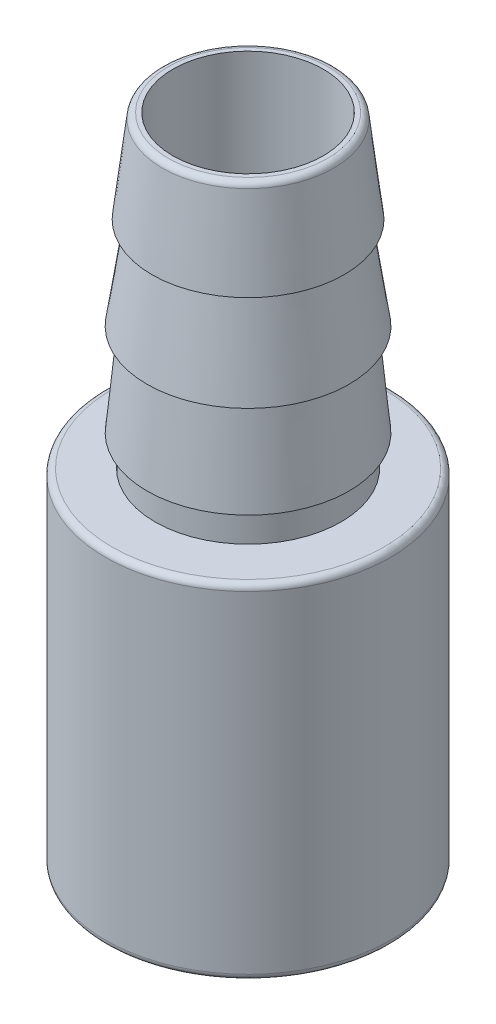
ISO-10303-21;
HEADER;
FILE_DESCRIPTION(('STEP AP214'),'2;1');
FILE_NAME('part.step','',(''),(''),'','','');
FILE_SCHEMA(('AUTOMOTIVE_DESIGN { 1 0 10303 214 1 1 1 1 }'));
ENDSEC;
DATA;
#1=APPLICATION_CONTEXT('core data for automotive mechanical design processes');
#2=APPLICATION_PROTOCOL_DEFINITION('international standard','automotive_design',2000,#1);
#3=PRODUCT_CONTEXT('',#1,'mechanical');
#4=PRODUCT('Part','Part','',(#3));
#5=PRODUCT_RELATED_PRODUCT_CATEGORY('part','',(#4));
#6=PRODUCT_DEFINITION_FORMATION('','',#4);
#7=PRODUCT_DEFINITION_CONTEXT('part definition',#1,'design');
#8=PRODUCT_DEFINITION('design','',#6,#7);
#9=PRODUCT_DEFINITION_SHAPE('','',#8);
#10=(LENGTH_UNIT() NAMED_UNIT(*) SI_UNIT(.MILLI.,.METRE.));
#11=(NAMED_UNIT(*) PLANE_ANGLE_UNIT() SI_UNIT($,.RADIAN.));
#12=(NAMED_UNIT(*) SI_UNIT($,.STERADIAN.) SOLID_ANGLE_UNIT());
#13=UNCERTAINTY_MEASURE_WITH_UNIT(LENGTH_MEASURE(1.E-05),#10,'distance_accuracy_value','');
#14=(GEOMETRIC_REPRESENTATION_CONTEXT(3) GLOBAL_UNCERTAINTY_ASSIGNED_CONTEXT((#13)) GLOBAL_UNIT_ASSIGNED_CONTEXT((#10,
#11,#12)) REPRESENTATION_CONTEXT('',''));
#15=CARTESIAN_POINT('',(0.,0.,0.));
#16=DIRECTION('',(0.,0.,1.));
#17=DIRECTION('',(1.,0.,0.));
#18=AXIS2_PLACEMENT_3D('',#15,#16,#17);
#19=CARTESIAN_POINT('',(0.,25.8957166504671,0.));
#20=DIRECTION('',(0.,-1.,0.));
#21=DIRECTION('',(0.,0.,-1.));
#22=AXIS2_PLACEMENT_3D('',#19,#20,#21);
#23=PLANE('',#22);
#24=CARTESIAN_POINT('',(0.,25.8957166504671,0.));
#25=DIRECTION('',(0.,1.,0.));
#26=DIRECTION('',(0.,0.,1.));
#27=AXIS2_PLACEMENT_3D('',#24,#25,#26);
#28=CIRCLE('',#27,6.10000000000001);
#29=CARTESIAN_POINT('',(0.,25.8957166504671,6.10000000000001));
#30=VERTEX_POINT('',#29);
#31=EDGE_CURVE('E77',#30,#30,#28,.T.);
#32=ORIENTED_EDGE('',*,*,#31,.T.);
#33=EDGE_LOOP('',(#32));
#34=FACE_BOUND('',#33,.T.);
#35=CARTESIAN_POINT('',(0.,25.8957166504671,0.));
#36=DIRECTION('',(0.,1.,0.));
#37=DIRECTION('',(0.,0.,1.));
#38=AXIS2_PLACEMENT_3D('',#35,#36,#37);
#39=CIRCLE('',#38,7.55000000000001);
#40=CARTESIAN_POINT('',(0.,25.8957166504671,7.55000000000001));
#41=VERTEX_POINT('',#40);
#42=EDGE_CURVE('E121',#41,#41,#39,.T.);
#43=ORIENTED_EDGE('',*,*,#42,.F.);
#44=EDGE_LOOP('',(#43));
#45=FACE_BOUND('',#44,.T.);
#46=ADVANCED_FACE('F32',(#34,#45),#23,.T.);
#47=CARTESIAN_POINT('',(0.,70.3957166504671,0.));
#48=DIRECTION('',(0.,1.,0.));
#49=DIRECTION('',(0.,0.,1.));
#50=AXIS2_PLACEMENT_3D('',#47,#48,#49);
#51=CYLINDRICAL_SURFACE('',#50,7.55000000000001);
#52=CARTESIAN_POINT('',(1.,13.674991934975,-7.48348180995986));
#53=CARTESIAN_POINT('',(0.999997640613019,13.6190864539056,-7.48348265423926));
#54=CARTESIAN_POINT('',(0.995296036754025,13.5631467247339,-7.4841150428414));
#55=CARTESIAN_POINT('',(0.976615883573541,13.4528260852176,-7.48657510165519));
#56=CARTESIAN_POINT('',(0.962627820510983,13.3984468332058,-7.4884039976302));
#57=CARTESIAN_POINT('',(0.925796103794292,13.2928602684275,-7.49304636890852));
#58=CARTESIAN_POINT('',(0.902958679565293,13.2416507536976,-7.49585915147884));
#59=CARTESIAN_POINT('',(0.84909024391177,13.143799773336,-7.50215153565137));
#60=CARTESIAN_POINT('',(0.818060556641651,13.0971575711365,-7.50563102946498));
#61=CARTESIAN_POINT('',(0.748480281164118,13.0094639626732,-7.51288919731403));
#62=CARTESIAN_POINT('',(0.709888543770355,12.9684453320248,-7.51666943783157));
#63=CARTESIAN_POINT('',(0.626368327509635,12.8934466140255,-7.52408910606824));
#64=CARTESIAN_POINT('',(0.581439524576133,12.8594668868515,-7.52772852657394));
#65=CARTESIAN_POINT('',(0.486313307119333,12.7993919338889,-7.53447263712252));
#66=CARTESIAN_POINT('',(0.436096901852783,12.7733265305236,-7.53757528609556));
#67=CARTESIAN_POINT('',(0.331951392465927,12.7300112397034,-7.54287901138871));
#68=CARTESIAN_POINT('',(0.27802244247006,12.7127609865419,-7.54508012510927));
#69=CARTESIAN_POINT('',(0.168318686206344,12.6876640341342,-7.5483217352535));
#70=CARTESIAN_POINT('',(0.112556578728956,12.6797627104133,-7.54936897112421));
#71=CARTESIAN_POINT('',(0.000488745168111114,12.6734185266338,-7.55020786913315));
#72=CARTESIAN_POINT('',(-0.0558169569485143,12.6749752514588,-7.54999958637649));
#73=CARTESIAN_POINT('',(-0.167001732315232,12.6874593859268,-7.54835634851858));
#74=CARTESIAN_POINT('',(-0.221887532155587,12.6983280431177,-7.54692908460145));
#75=CARTESIAN_POINT('',(-0.329049268191321,12.7290355725875,-7.54301686104313));
#76=CARTESIAN_POINT('',(-0.381325149669249,12.748874632845,-7.54053187923707));
#77=CARTESIAN_POINT('',(-0.481963880824524,12.7970216343162,-7.53477017709603));
#78=CARTESIAN_POINT('',(-0.530314519173603,12.8253548070782,-7.53149110358868));
#79=CARTESIAN_POINT('',(-0.621597073702879,12.8896673867975,-7.52450769037079));
#80=CARTESIAN_POINT('',(-0.664528710848169,12.9256471872387,-7.52080332878008));
#81=CARTESIAN_POINT('',(-0.744100092821038,13.0045602658171,-7.51334995766458));
#82=CARTESIAN_POINT('',(-0.780689037497986,13.0475447749502,-7.5096008236412));
#83=CARTESIAN_POINT('',(-0.846141068694628,13.1390716527936,-7.5025084155099));
#84=CARTESIAN_POINT('',(-0.875004125317424,13.1876140430104,-7.49916514297256));
#85=CARTESIAN_POINT('',(-0.924189065956958,13.2889261475474,-7.49326307475917));
#86=CARTESIAN_POINT('',(-0.944506559853983,13.3416980181499,-7.49070468248253));
#87=CARTESIAN_POINT('',(-0.975976904681863,13.4499461142858,-7.48666969582466));
#88=CARTESIAN_POINT('',(-0.987130253631255,13.5054221926875,-7.48519304265759));
#89=CARTESIAN_POINT('',(-0.999887763056672,13.6170543546708,-7.48349959875886));
#90=CARTESIAN_POINT('',(-1.00156356013777,13.6732021134431,-7.4832733570197));
#91=CARTESIAN_POINT('',(-0.995507710475869,13.784977597904,-7.48408133066248));
#92=CARTESIAN_POINT('',(-0.987776289556676,13.8406053360435,-7.48511551578741));
#93=CARTESIAN_POINT('',(-0.963185912333842,13.9495450141197,-7.48831917716092));
#94=CARTESIAN_POINT('',(-0.946361923098478,14.0028649860005,-7.49048430311605));
#95=CARTESIAN_POINT('',(-0.904100080061533,14.1059274071525,-7.49570234921866));
#96=CARTESIAN_POINT('',(-0.878661888714919,14.1556697161414,-7.49875530415481));
#97=CARTESIAN_POINT('',(-0.819718732023109,14.2504880862665,-7.50542755458955));
#98=CARTESIAN_POINT('',(-0.786166957817709,14.2955348170926,-7.50905009207914));
#99=CARTESIAN_POINT('',(-0.712014907974461,14.3793834274715,-7.5164432808062));
#100=CARTESIAN_POINT('',(-0.671414323737639,14.4181850334675,-7.52021393852282));
#101=CARTESIAN_POINT('',(-0.584003499352055,14.4886951771338,-7.52750768704761));
#102=CARTESIAN_POINT('',(-0.537155029687152,14.5203565287481,-7.5310290311412));
#103=CARTESIAN_POINT('',(-0.438763239146897,14.5753602911591,-7.53740099768828));
#104=CARTESIAN_POINT('',(-0.38722002273137,14.5987028869945,-7.54025163506019));
#105=CARTESIAN_POINT('',(-0.28105599632715,14.6363293090077,-7.54495327577493));
#106=CARTESIAN_POINT('',(-0.226444841506163,14.6506399920988,-7.54680724032166));
#107=CARTESIAN_POINT('',(-0.115568535814665,14.6698836134998,-7.54931897967579));
#108=CARTESIAN_POINT('',(-0.0593034693102814,14.6748170293045,-7.54997681539056));
#109=CARTESIAN_POINT('',(0.0528236449198729,14.6751563891076,-7.55002180016256));
#110=CARTESIAN_POINT('',(0.108685482852354,14.670634931915,-7.54941863179005));
#111=CARTESIAN_POINT('',(0.218847676466017,14.6523471715739,-7.54702869960805));
#112=CARTESIAN_POINT('',(0.273148034208349,14.6385808806291,-7.54524193736098));
#113=CARTESIAN_POINT('',(0.378633419365933,14.6022178763951,-7.54068464787495));
#114=CARTESIAN_POINT('',(0.429819817243945,14.5796250806478,-7.53791455712472));
#115=CARTESIAN_POINT('',(0.527686400251396,14.5262579445694,-7.53169664704556));
#116=CARTESIAN_POINT('',(0.574366505358342,14.4954834589847,-7.52824881568465));
#117=CARTESIAN_POINT('',(0.662265660663392,14.4263595184914,-7.52102827785906));
#118=CARTESIAN_POINT('',(0.703442125090811,14.3879561367056,-7.5172533731582));
#119=CARTESIAN_POINT('',(0.778793927128469,14.3047772577294,-7.50982140164662));
#120=CARTESIAN_POINT('',(0.812967609534731,14.2600002582752,-7.50616436286687));
#121=CARTESIAN_POINT('',(0.87347263568008,14.1651205179634,-7.49936526266101));
#122=CARTESIAN_POINT('',(0.899769331784437,14.1149955260788,-7.49622550298327));
#123=CARTESIAN_POINT('',(0.943533587720554,14.0110259446555,-7.49084340201406));
#124=CARTESIAN_POINT('',(0.961010628019889,13.9571854201333,-7.48860009764286));
#125=CARTESIAN_POINT('',(0.982515613613414,13.8650620170025,-7.48580228841438));
#126=CARTESIAN_POINT('',(0.98906266437653,13.8273571008755,-7.48493651966568));
#127=CARTESIAN_POINT('',(0.997805644846225,13.7514374371102,-7.48377599431257));
#128=CARTESIAN_POINT('',(1.00000161345817,13.7132226940337,-7.48348123260248));
#129=CARTESIAN_POINT('',(1.,13.674991934975,-7.48348180995986));
#130=B_SPLINE_CURVE_WITH_KNOTS('',3,(#52,#53,#54,#55,#56,#57,#58,#59,#60,#61,#62,#63,#64,#65,
#66,#67,#68,#69,#70,#71,#72,#73,#74,#75,#76,#77,#78,#79,#80,#81,#82,#83,#84,#85,#86,#87,#88,#89,
#90,#91,#92,#93,#94,#95,#96,#97,#98,#99,#100,#101,#102,#103,#104,#105,#106,#107,#108,#109,#110,
#111,#112,#113,#114,#115,#116,#117,#118,#119,#120,#121,#122,#123,#124,#125,#126,#127,#128,#129),
.UNSPECIFIED.,.T.,.F.,(4,2,2,2,2,2,2,2,2,2,2,2,2,2,2,2,2,2,2,2,2,2,2,2,2,2,2,2,2,2,2,2,2,2,2,2,
2,2,4),(0.,0.167576760071937,0.335325463741895,0.502956296172008,0.67056005020457,
0.839102507506484,1.00765358690444,1.17683212896286,1.34600365188916,1.51418177018709,
1.682352507149,1.84946994081086,2.01659087665251,2.18421324449273,2.35184424001652,
2.52076134429805,2.68967910222928,2.85868353275346,3.0276787782519,3.19539493890875,
3.36310707355562,3.5301787840262,3.6972570419114,3.8653232213909,4.03339676071346,
4.20255042353081,4.37170032353661,4.54034484696533,4.70898078270494,4.87632661132946,
5.04367221904775,5.21094363658444,5.37821802397133,5.54671984363562,5.71526144520251,
5.88453385885968,6.05362392772651,6.16822170778501,6.28281846315849),.UNSPECIFIED.);
#131=CARTESIAN_POINT('',(1.,13.674991934975,-7.48348180995986));
#132=VERTEX_POINT('',#131);
#133=EDGE_CURVE('E70',#132,#132,#130,.T.);
#134=ORIENTED_EDGE('',*,*,#133,.T.);
#135=EDGE_LOOP('',(#134));
#136=FACE_BOUND('',#135,.T.);
#137=CARTESIAN_POINT('',(0.,0.5,0.));
#138=DIRECTION('',(0.,-1.,0.));
#139=DIRECTION('',(0.,0.,-1.));
#140=AXIS2_PLACEMENT_3D('',#137,#138,#139);
#141=CIRCLE('',#140,7.55000000000001);
#142=CARTESIAN_POINT('',(0.,0.5,-7.55000000000001));
#143=VERTEX_POINT('',#142);
#144=EDGE_CURVE('E110',#143,#143,#141,.T.);
#145=ORIENTED_EDGE('',*,*,#144,.T.);
#146=EDGE_LOOP('',(#145));
#147=FACE_BOUND('',#146,.T.);
#148=ORIENTED_EDGE('',*,*,#42,.T.);
#149=EDGE_LOOP('',(#148));
#150=FACE_BOUND('',#149,.T.);
#151=ADVANCED_FACE('F79',(#136,#147,#150),#51,.F.);
#152=CARTESIAN_POINT('',(0.,0.,0.));
#153=DIRECTION('',(0.,-1.,0.));
#154=DIRECTION('',(0.,0.,-1.));
#155=AXIS2_PLACEMENT_3D('',#152,#153,#154);
#156=PLANE('',#155);
#157=CARTESIAN_POINT('',(0.,0.,0.));
#158=DIRECTION('',(0.,-1.,0.));
#159=DIRECTION('',(0.,0.,-1.));
#160=AXIS2_PLACEMENT_3D('',#157,#158,#159);
#161=CIRCLE('',#160,8.05000000000001);
#162=CARTESIAN_POINT('',(0.,0.,-8.05000000000001));
#163=VERTEX_POINT('',#162);
#164=EDGE_CURVE('E115',#163,#163,#161,.F.);
#165=ORIENTED_EDGE('',*,*,#164,.T.);
#166=EDGE_LOOP('',(#165));
#167=FACE_BOUND('',#166,.T.);
#168=CARTESIAN_POINT('',(0.,0.,0.));
#169=DIRECTION('',(0.,-1.,0.));
#170=DIRECTION('',(0.,0.,-1.));
#171=AXIS2_PLACEMENT_3D('',#168,#169,#170);
#172=CIRCLE('',#171,11.05);
#173=CARTESIAN_POINT('',(0.,0.,-11.05));
#174=VERTEX_POINT('',#173);
#175=EDGE_CURVE('E118',#174,#174,#172,.T.);
#176=ORIENTED_EDGE('',*,*,#175,.T.);
#177=EDGE_LOOP('',(#176));
#178=FACE_BOUND('',#177,.T.);
#179=ADVANCED_FACE('F83',(#167,#178),#156,.T.);
#180=CARTESIAN_POINT('',(0.,70.3957166504671,0.));
#181=DIRECTION('',(0.,1.,0.));
#182=DIRECTION('',(0.,0.,1.));
#183=AXIS2_PLACEMENT_3D('',#180,#181,#182);
#184=CYLINDRICAL_SURFACE('',#183,11.55);
#185=CARTESIAN_POINT('',(0.,14.674991934975,-11.55));
#186=CARTESIAN_POINT('',(0.0560578244863341,14.6749894900842,-11.5499994344142));
#187=CARTESIAN_POINT('',(0.112153612463427,14.6702623572232,-11.5495875376148));
#188=CARTESIAN_POINT('',(0.22279256491471,14.6514748111112,-11.5479840030939));
#189=CARTESIAN_POINT('',(0.277333906755566,14.6374038764975,-11.5467914863958));
#190=CARTESIAN_POINT('',(0.383245599229549,14.6003391726797,-11.5437614458452));
#191=CARTESIAN_POINT('',(0.434617746490383,14.5773505138554,-11.5419242914654));
#192=CARTESIAN_POINT('',(0.53276210303234,14.523112212472,-11.5378108938728));
#193=CARTESIAN_POINT('',(0.579535280856685,14.4918643144437,-11.5355347434129));
#194=CARTESIAN_POINT('',(0.667294170547527,14.4219022567648,-11.5307917163195));
#195=CARTESIAN_POINT('',(0.708265544079087,14.3831701403145,-11.5283243897037));
#196=CARTESIAN_POINT('',(0.783134731316184,14.2993771309654,-11.5234808589613));
#197=CARTESIAN_POINT('',(0.817032231391381,14.2543159576068,-11.5211046588788));
#198=CARTESIAN_POINT('',(0.876840449139779,14.159056528797,-11.5167076364597));
#199=CARTESIAN_POINT('',(0.902738487976201,14.1088502846138,-11.5146873804356));
#200=CARTESIAN_POINT('',(0.945731650141792,14.0047815071507,-11.5112362308391));
#201=CARTESIAN_POINT('',(0.962826940093408,13.9509190430993,-11.5098053261113));
#202=CARTESIAN_POINT('',(0.987687551404368,13.8412110003161,-11.5076987351699));
#203=CARTESIAN_POINT('',(0.995476323109767,13.7853707726408,-11.5070211510579));
#204=CARTESIAN_POINT('',(1.00157525638104,13.6731717858507,-11.5064919443972));
#205=CARTESIAN_POINT('',(0.99988560867587,13.6168130371926,-11.5066403052285));
#206=CARTESIAN_POINT('',(0.987095037094844,13.5053377011433,-11.5077444990457));
#207=CARTESIAN_POINT('',(0.976019620402118,13.4502181623723,-11.5086981435319));
#208=CARTESIAN_POINT('',(0.944811540217406,13.3426233089083,-11.5113020227798));
#209=CARTESIAN_POINT('',(0.924678782110638,13.290148021844,-11.5129522648184));
#210=CARTESIAN_POINT('',(0.875899028289694,13.1892500944198,-11.5167659171675));
#211=CARTESIAN_POINT('',(0.847240611661792,13.1408330026169,-11.5189300150458));
#212=CARTESIAN_POINT('',(0.782231276396427,13.0494865339873,-11.5235269149064));
#213=CARTESIAN_POINT('',(0.745880189419656,13.0065572772842,-11.5259597227683));
#214=CARTESIAN_POINT('',(0.666374432830062,12.927256788038,-11.5308296650488));
#215=CARTESIAN_POINT('',(0.623197715994081,12.8909076553685,-11.5332667872675));
#216=CARTESIAN_POINT('',(0.53134317985483,12.8259701801145,-11.5378631226712));
#217=CARTESIAN_POINT('',(0.482665356480305,12.7973818432737,-11.5400223356505));
#218=CARTESIAN_POINT('',(0.381175856208747,12.7487787650232,-11.5438200299217));
#219=CARTESIAN_POINT('',(0.328363695820544,12.7287650281493,-11.5454584501956));
#220=CARTESIAN_POINT('',(0.220111371250544,12.6978948699206,-11.5480292703998));
#221=CARTESIAN_POINT('',(0.164671265975845,12.6870382434056,-11.5489616861477));
#222=CARTESIAN_POINT('',(0.0529283196158,12.6748182531018,-11.5500134092372));
#223=CARTESIAN_POINT('',(-0.00337116027521723,12.6734243690096,-11.55013533065));
#224=CARTESIAN_POINT('',(-0.115402988330331,12.680089440653,-11.5495593145534));
#225=CARTESIAN_POINT('',(-0.171135342205555,12.6881483011013,-11.5488613853083));
#226=CARTESIAN_POINT('',(-0.280363664539787,12.7134647997182,-11.5467258262852));
#227=CARTESIAN_POINT('',(-0.333862942028466,12.730708265294,-11.5452893362848));
#228=CARTESIAN_POINT('',(-0.437209028822321,12.7738900038199,-11.5418379864581));
#229=CARTESIAN_POINT('',(-0.487055775938352,12.7998284247712,-11.539823116787));
#230=CARTESIAN_POINT('',(-0.581820565559558,12.8597402929963,-11.5354342685125));
#231=CARTESIAN_POINT('',(-0.626725802041461,12.8937339293042,-11.533059393093));
#232=CARTESIAN_POINT('',(-0.710203541496391,12.9687621489677,-11.5282202750518));
#233=CARTESIAN_POINT('',(-0.748775925655149,13.0097968643954,-11.5257560307545));
#234=CARTESIAN_POINT('',(-0.818597953438829,13.097874989501,-11.5210081488787));
#235=CARTESIAN_POINT('',(-0.849827659897879,13.1449342347962,-11.518725013931));
#236=CARTESIAN_POINT('',(-0.903941069415019,13.2436468870371,-11.5146050806873));
#237=CARTESIAN_POINT('',(-0.926824861457194,13.2953002449932,-11.5127682776327));
#238=CARTESIAN_POINT('',(-0.963562999307351,13.4016646805168,-11.5097518652615));
#239=CARTESIAN_POINT('',(-0.977429487809073,13.456371537933,-11.5085713724703));
#240=CARTESIAN_POINT('',(-0.995778910376381,13.5673476889178,-11.5069983276898));
#241=CARTESIAN_POINT('',(-1.00026204059386,13.6236169498006,-11.5066057592295));
#242=CARTESIAN_POINT('',(-0.999715140480273,13.7359224928083,-11.5066532728225));
#243=CARTESIAN_POINT('',(-0.994716434214648,13.7919589312902,-11.5070906132021));
#244=CARTESIAN_POINT('',(-0.975413137997987,13.9023931553893,-11.5087428384314));
#245=CARTESIAN_POINT('',(-0.961108534450059,13.9567909386121,-11.5099577244172));
#246=CARTESIAN_POINT('',(-0.923607567206043,14.062405316279,-11.5130274255696));
#247=CARTESIAN_POINT('',(-0.900411834949563,14.1136221363321,-11.5148821952915));
#248=CARTESIAN_POINT('',(-0.845790497448002,14.2114398916793,-11.5190227584808));
#249=CARTESIAN_POINT('',(-0.814365006271921,14.2580408909389,-11.521308545974));
#250=CARTESIAN_POINT('',(-0.744058456973401,14.3454645548989,-11.5260625904387));
#251=CARTESIAN_POINT('',(-0.705154166667019,14.3862685061081,-11.5285314008737));
#252=CARTESIAN_POINT('',(-0.621037442344666,14.4607844391184,-11.5333682566656));
#253=CARTESIAN_POINT('',(-0.575823487124325,14.494494705765,-11.5357362775428));
#254=CARTESIAN_POINT('',(-0.480277128609662,14.5539153494359,-11.540109351426));
#255=CARTESIAN_POINT('',(-0.429934778869163,14.579609772344,-11.5421136772879));
#256=CARTESIAN_POINT('',(-0.325666932187058,14.6221478597633,-11.5455251383361));
#257=CARTESIAN_POINT('',(-0.271745620074903,14.6390016630384,-11.5469329572616));
#258=CARTESIAN_POINT('',(-0.181257066127906,14.6591039348296,-11.548632753835));
#259=CARTESIAN_POINT('',(-0.145271168532271,14.6650539760715,-11.5491431268318));
#260=CARTESIAN_POINT('',(-0.0728621934183076,14.6729987650206,-11.5498269332479));
#261=CARTESIAN_POINT('',(-0.0364391171706384,14.6749935242208,-11.5500003676462));
#262=CARTESIAN_POINT('',(0.,14.674991934975,-11.55));
#263=B_SPLINE_CURVE_WITH_KNOTS('',3,(#185,#186,#187,#188,#189,#190,#191,#192,#193,#194,#195,
#196,#197,#198,#199,#200,#201,#202,#203,#204,#205,#206,#207,#208,#209,#210,#211,#212,#213,#214,
#215,#216,#217,#218,#219,#220,#221,#222,#223,#224,#225,#226,#227,#228,#229,#230,#231,#232,#233,
#234,#235,#236,#237,#238,#239,#240,#241,#242,#243,#244,#245,#246,#247,#248,#249,#250,#251,#252,
#253,#254,#255,#256,#257,#258,#259,#260,#261,#262),.UNSPECIFIED.,.T.,.F.,(4,2,2,2,2,2,2,2,2,2,2,
2,2,2,2,2,2,2,2,2,2,2,2,2,2,2,2,2,2,2,2,2,2,2,2,2,2,2,4),(0.,0.168040427383807,
0.336270394226343,0.504404097496694,0.672502315615184,0.841008973325278,1.00952310043358,
1.17830296141702,1.3470796275408,1.51543011124703,1.68377720734237,1.85166825765571,
2.01956106183292,2.18767979464862,2.35580220680024,2.52447919914355,2.69315631632199,
2.8618531890447,3.03054628210357,3.19869502760565,3.36684207812056,3.53473041255828,
3.70262160485235,3.87093812364682,4.03925779996311,4.20802935940897,4.37679911936096,
4.54534114087874,4.71387963911987,4.88186232540034,5.0498452571217,5.21781626106278,
5.38578493695627,5.55428407896331,5.7228239150309,5.89169709064255,6.0603761701943,
6.16960735552637,6.27883822345517),.UNSPECIFIED.);
#264=CARTESIAN_POINT('',(0.,14.674991934975,-11.55));
#265=VERTEX_POINT('',#264);
#266=EDGE_CURVE('E43',#265,#265,#263,.T.);
#267=ORIENTED_EDGE('',*,*,#266,.F.);
#268=EDGE_LOOP('',(#267));
#269=FACE_BOUND('',#268,.T.);
#270=CARTESIAN_POINT('',(0.,0.5,0.));
#271=DIRECTION('',(0.,-1.,0.));
#272=DIRECTION('',(0.,0.,-1.));
#273=AXIS2_PLACEMENT_3D('',#270,#271,#272);
#274=CIRCLE('',#273,11.55);
#275=CARTESIAN_POINT('',(0.,0.5,-11.55));
#276=VERTEX_POINT('',#275);
#277=EDGE_CURVE('E106',#276,#276,#274,.F.);
#278=ORIENTED_EDGE('',*,*,#277,.T.);
#279=EDGE_LOOP('',(#278));
#280=FACE_BOUND('',#279,.T.);
#281=CARTESIAN_POINT('',(0.,27.3957166504671,0.));
#282=DIRECTION('',(0.,-1.,0.));
#283=DIRECTION('',(0.,0.,-1.));
#284=AXIS2_PLACEMENT_3D('',#281,#282,#283);
#285=CIRCLE('',#284,11.55);
#286=CARTESIAN_POINT('',(0.,27.3957166504671,-11.55));
#287=VERTEX_POINT('',#286);
#288=EDGE_CURVE('E102',#287,#287,#285,.T.);
#289=ORIENTED_EDGE('',*,*,#288,.T.);
#290=EDGE_LOOP('',(#289));
#291=FACE_BOUND('',#290,.T.);
#292=ADVANCED_FACE('F56',(#269,#280,#291),#184,.T.);
#293=CARTESIAN_POINT('',(0.,27.8957166504671,0.));
#294=DIRECTION('',(0.,-1.,0.));
#295=DIRECTION('',(0.,0.,-1.));
#296=AXIS2_PLACEMENT_3D('',#293,#294,#295);
#297=PLANE('',#296);
#298=CARTESIAN_POINT('',(0.,27.8957166504671,0.));
#299=DIRECTION('',(0.,-1.,0.));
#300=DIRECTION('',(0.,0.,-1.));
#301=AXIS2_PLACEMENT_3D('',#298,#299,#300);
#302=CIRCLE('',#301,11.05);
#303=CARTESIAN_POINT('',(0.,27.8957166504671,-11.05));
#304=VERTEX_POINT('',#303);
#305=EDGE_CURVE('E47',#304,#304,#302,.F.);
#306=ORIENTED_EDGE('',*,*,#305,.T.);
#307=EDGE_LOOP('',(#306));
#308=FACE_BOUND('',#307,.T.);
#309=CARTESIAN_POINT('',(0.,27.8957166504671,0.));
#310=DIRECTION('',(0.,1.,0.));
#311=DIRECTION('',(0.,0.,1.));
#312=AXIS2_PLACEMENT_3D('',#309,#310,#311);
#313=CIRCLE('',#312,7.55000000000001);
#314=CARTESIAN_POINT('',(0.,27.8957166504671,7.55000000000001));
#315=VERTEX_POINT('',#314);
#316=EDGE_CURVE('E124',#315,#315,#313,.T.);
#317=ORIENTED_EDGE('',*,*,#316,.F.);
#318=EDGE_LOOP('',(#317));
#319=FACE_BOUND('',#318,.T.);
#320=ADVANCED_FACE('F186',(#308,#319),#297,.F.);
#321=CARTESIAN_POINT('',(0.,70.3957166504671,0.));
#322=DIRECTION('',(0.,1.,0.));
#323=DIRECTION('',(0.,0.,1.));
#324=AXIS2_PLACEMENT_3D('',#321,#322,#323);
#325=CYLINDRICAL_SURFACE('',#324,7.55000000000001);
#326=CARTESIAN_POINT('',(0.,30.3957166504671,0.));
#327=DIRECTION('',(0.,1.,0.));
#328=DIRECTION('',(0.,0.,1.));
#329=AXIS2_PLACEMENT_3D('',#326,#327,#328);
#330=CIRCLE('',#329,7.55000000000001);
#331=CARTESIAN_POINT('',(0.,30.3957166504671,7.55000000000001));
#332=VERTEX_POINT('',#331);
#333=EDGE_CURVE('E127',#332,#332,#330,.T.);
#334=ORIENTED_EDGE('',*,*,#333,.F.);
#335=EDGE_LOOP('',(#334));
#336=FACE_BOUND('',#335,.T.);
#337=ORIENTED_EDGE('',*,*,#316,.T.);
#338=EDGE_LOOP('',(#337));
#339=FACE_BOUND('',#338,.T.);
#340=ADVANCED_FACE('F183',(#336,#339),#325,.T.);
#341=CARTESIAN_POINT('',(0.,30.3957166504671,0.));
#342=DIRECTION('',(0.,1.,0.));
#343=DIRECTION('',(0.,0.,1.));
#344=AXIS2_PLACEMENT_3D('',#341,#342,#343);
#345=PLANE('',#344);
#346=CARTESIAN_POINT('',(0.,30.3957166504671,0.));
#347=DIRECTION('',(0.,1.,0.));
#348=DIRECTION('',(0.,0.,1.));
#349=AXIS2_PLACEMENT_3D('',#346,#347,#348);
#350=CIRCLE('',#349,8.20000000000001);
#351=CARTESIAN_POINT('',(0.,30.3957166504671,8.20000000000001));
#352=VERTEX_POINT('',#351);
#353=EDGE_CURVE('E130',#352,#352,#350,.T.);
#354=ORIENTED_EDGE('',*,*,#353,.F.);
#355=EDGE_LOOP('',(#354));
#356=FACE_BOUND('',#355,.T.);
#357=ORIENTED_EDGE('',*,*,#333,.T.);
#358=EDGE_LOOP('',(#357));
#359=FACE_BOUND('',#358,.T.);
#360=ADVANCED_FACE('F179',(#356,#359),#345,.F.);
#361=CARTESIAN_POINT('',(0.,30.3957166504671,0.));
#362=DIRECTION('',(0.,-1.,0.));
#363=DIRECTION('',(0.,0.,-1.));
#364=AXIS2_PLACEMENT_3D('',#361,#362,#363);
#365=CONICAL_SURFACE('',#364,8.20000000000001,0.0930637287244181);
#366=CARTESIAN_POINT('',(0.,37.8957166504671,0.));
#367=DIRECTION('',(0.,1.,0.));
#368=DIRECTION('',(0.,0.,1.));
#369=AXIS2_PLACEMENT_3D('',#366,#367,#368);
#370=CIRCLE('',#369,7.50000000000001);
#371=CARTESIAN_POINT('',(0.,37.8957166504671,7.50000000000001));
#372=VERTEX_POINT('',#371);
#373=EDGE_CURVE('E133',#372,#372,#370,.T.);
#374=ORIENTED_EDGE('',*,*,#373,.F.);
#375=EDGE_LOOP('',(#374));
#376=FACE_BOUND('',#375,.T.);
#377=ORIENTED_EDGE('',*,*,#353,.T.);
#378=EDGE_LOOP('',(#377));
#379=FACE_BOUND('',#378,.T.);
#380=ADVANCED_FACE('F175',(#376,#379),#365,.T.);
#381=CARTESIAN_POINT('',(0.,37.8957166504671,0.));
#382=DIRECTION('',(0.,-1.,0.));
#383=DIRECTION('',(0.,0.,-1.));
#384=AXIS2_PLACEMENT_3D('',#381,#382,#383);
#385=PLANE('',#384);
#386=ORIENTED_EDGE('',*,*,#373,.T.);
#387=EDGE_LOOP('',(#386));
#388=FACE_BOUND('',#387,.T.);
#389=CARTESIAN_POINT('',(0.,37.8957166504671,0.));
#390=DIRECTION('',(0.,1.,0.));
#391=DIRECTION('',(0.,0.,1.));
#392=AXIS2_PLACEMENT_3D('',#389,#390,#391);
#393=CIRCLE('',#392,8.20000000000001);
#394=CARTESIAN_POINT('',(0.,37.8957166504671,8.20000000000001));
#395=VERTEX_POINT('',#394);
#396=EDGE_CURVE('E136',#395,#395,#393,.T.);
#397=ORIENTED_EDGE('',*,*,#396,.F.);
#398=EDGE_LOOP('',(#397));
#399=FACE_BOUND('',#398,.T.);
#400=ADVANCED_FACE('F171',(#388,#399),#385,.T.);
#401=CARTESIAN_POINT('',(0.,45.3957166504671,0.));
#402=DIRECTION('',(0.,-1.,0.));
#403=DIRECTION('',(0.,0.,-1.));
#404=AXIS2_PLACEMENT_3D('',#401,#402,#403);
#405=CONICAL_SURFACE('',#404,7.10000000000001,0.145628380570822);
#406=ORIENTED_EDGE('',*,*,#396,.T.);
#407=EDGE_LOOP('',(#406));
#408=FACE_BOUND('',#407,.T.);
#409=CARTESIAN_POINT('',(0.,45.3957166504671,0.));
#410=DIRECTION('',(0.,1.,0.));
#411=DIRECTION('',(0.,0.,1.));
#412=AXIS2_PLACEMENT_3D('',#409,#410,#411);
#413=CIRCLE('',#412,7.10000000000001);
#414=CARTESIAN_POINT('',(0.,45.3957166504671,7.10000000000001));
#415=VERTEX_POINT('',#414);
#416=EDGE_CURVE('E139',#415,#415,#413,.T.);
#417=ORIENTED_EDGE('',*,*,#416,.F.);
#418=EDGE_LOOP('',(#417));
#419=FACE_BOUND('',#418,.T.);
#420=ADVANCED_FACE('F167',(#408,#419),#405,.T.);
#421=CARTESIAN_POINT('',(0.,45.3957166504671,0.));
#422=DIRECTION('',(0.,-1.,0.));
#423=DIRECTION('',(0.,0.,-1.));
#424=AXIS2_PLACEMENT_3D('',#421,#422,#423);
#425=PLANE('',#424);
#426=ORIENTED_EDGE('',*,*,#416,.T.);
#427=EDGE_LOOP('',(#426));
#428=FACE_BOUND('',#427,.T.);
#429=CARTESIAN_POINT('',(0.,45.3957166504671,0.));
#430=DIRECTION('',(0.,1.,0.));
#431=DIRECTION('',(0.,0.,1.));
#432=AXIS2_PLACEMENT_3D('',#429,#430,#431);
#433=CIRCLE('',#432,7.80000000000001);
#434=CARTESIAN_POINT('',(0.,45.3957166504671,7.80000000000001));
#435=VERTEX_POINT('',#434);
#436=EDGE_CURVE('E142',#435,#435,#433,.T.);
#437=ORIENTED_EDGE('',*,*,#436,.F.);
#438=EDGE_LOOP('',(#437));
#439=FACE_BOUND('',#438,.T.);
#440=ADVANCED_FACE('F161',(#428,#439),#425,.T.);
#441=CARTESIAN_POINT('',(0.,52.8957166504671,0.));
#442=DIRECTION('',(0.,-1.,0.));
#443=DIRECTION('',(0.,0.,-1.));
#444=AXIS2_PLACEMENT_3D('',#441,#442,#443);
#445=CONICAL_SURFACE('',#444,6.90000000000001,0.119428926018339);
#446=CARTESIAN_POINT('',(0.,52.4552892607763,0.));
#447=DIRECTION('',(0.,-1.,0.));
#448=DIRECTION('',(0.,0.,-1.));
#449=AXIS2_PLACEMENT_3D('',#446,#447,#448);
#450=CIRCLE('',#449,6.9528512867629);
#451=CARTESIAN_POINT('',(0.,52.4552892607763,-6.9528512867629));
#452=VERTEX_POINT('',#451);
#453=EDGE_CURVE('E10',#452,#452,#450,.T.);
#454=ORIENTED_EDGE('',*,*,#453,.T.);
#455=EDGE_LOOP('',(#454));
#456=FACE_BOUND('',#455,.T.);
#457=ORIENTED_EDGE('',*,*,#436,.T.);
#458=EDGE_LOOP('',(#457));
#459=FACE_BOUND('',#458,.T.);
#460=ADVANCED_FACE('F157',(#456,#459),#445,.T.);
#461=CARTESIAN_POINT('',(0.,52.8957166504671,0.));
#462=DIRECTION('',(0.,-1.,0.));
#463=DIRECTION('',(0.,0.,-1.));
#464=AXIS2_PLACEMENT_3D('',#461,#462,#463);
#465=PLANE('',#464);
#466=CARTESIAN_POINT('',(0.,52.8957166504671,0.));
#467=DIRECTION('',(0.,-1.,0.));
#468=DIRECTION('',(0.,0.,-1.));
#469=AXIS2_PLACEMENT_3D('',#466,#467,#468);
#470=CIRCLE('',#469,6.45641286751944);
#471=CARTESIAN_POINT('',(0.,52.8957166504671,-6.45641286751944));
#472=VERTEX_POINT('',#471);
#473=EDGE_CURVE('E39',#472,#472,#470,.F.);
#474=ORIENTED_EDGE('',*,*,#473,.T.);
#475=EDGE_LOOP('',(#474));
#476=FACE_BOUND('',#475,.T.);
#477=CARTESIAN_POINT('',(0.,52.8957166504671,0.));
#478=DIRECTION('',(0.,1.,0.));
#479=DIRECTION('',(0.,0.,1.));
#480=AXIS2_PLACEMENT_3D('',#477,#478,#479);
#481=CIRCLE('',#480,6.10000000000001);
#482=CARTESIAN_POINT('',(0.,52.8957166504671,6.10000000000001));
#483=VERTEX_POINT('',#482);
#484=EDGE_CURVE('E144',#483,#483,#481,.T.);
#485=ORIENTED_EDGE('',*,*,#484,.F.);
#486=EDGE_LOOP('',(#485));
#487=FACE_BOUND('',#486,.T.);
#488=ADVANCED_FACE('F153',(#476,#487),#465,.F.);
#489=CARTESIAN_POINT('',(0.,70.3957166504671,0.));
#490=DIRECTION('',(0.,1.,0.));
#491=DIRECTION('',(0.,0.,1.));
#492=AXIS2_PLACEMENT_3D('',#489,#490,#491);
#493=CYLINDRICAL_SURFACE('',#492,6.10000000000001);
#494=ORIENTED_EDGE('',*,*,#484,.T.);
#495=EDGE_LOOP('',(#494));
#496=FACE_BOUND('',#495,.T.);
#497=ORIENTED_EDGE('',*,*,#31,.F.);
#498=EDGE_LOOP('',(#497));
#499=FACE_BOUND('',#498,.T.);
#500=ADVANCED_FACE('F66',(#496,#499),#493,.F.);
#501=CARTESIAN_POINT('',(0.,0.5,0.));
#502=DIRECTION('',(0.,-1.,0.));
#503=DIRECTION('',(0.,0.,-1.));
#504=AXIS2_PLACEMENT_3D('',#501,#502,#503);
#505=TOROIDAL_SURFACE('',#504,8.05000000000001,0.5);
#506=ORIENTED_EDGE('',*,*,#144,.F.);
#507=EDGE_LOOP('',(#506));
#508=FACE_BOUND('',#507,.T.);
#509=ORIENTED_EDGE('',*,*,#164,.F.);
#510=EDGE_LOOP('',(#509));
#511=FACE_BOUND('',#510,.T.);
#512=ADVANCED_FACE('F88',(#508,#511),#505,.T.);
#513=CARTESIAN_POINT('',(0.,0.5,0.));
#514=DIRECTION('',(0.,-1.,0.));
#515=DIRECTION('',(0.,0.,-1.));
#516=AXIS2_PLACEMENT_3D('',#513,#514,#515);
#517=TOROIDAL_SURFACE('',#516,11.05,0.5);
#518=ORIENTED_EDGE('',*,*,#175,.F.);
#519=EDGE_LOOP('',(#518));
#520=FACE_BOUND('',#519,.T.);
#521=ORIENTED_EDGE('',*,*,#277,.F.);
#522=EDGE_LOOP('',(#521));
#523=FACE_BOUND('',#522,.T.);
#524=ADVANCED_FACE('F91',(#520,#523),#517,.T.);
#525=CARTESIAN_POINT('',(0.,27.3957166504671,0.));
#526=DIRECTION('',(0.,-1.,0.));
#527=DIRECTION('',(0.,0.,-1.));
#528=AXIS2_PLACEMENT_3D('',#525,#526,#527);
#529=TOROIDAL_SURFACE('',#528,11.05,0.5);
#530=ORIENTED_EDGE('',*,*,#288,.F.);
#531=EDGE_LOOP('',(#530));
#532=FACE_BOUND('',#531,.T.);
#533=ORIENTED_EDGE('',*,*,#305,.F.);
#534=EDGE_LOOP('',(#533));
#535=FACE_BOUND('',#534,.T.);
#536=ADVANCED_FACE('F64',(#532,#535),#529,.T.);
#537=CARTESIAN_POINT('',(0.,13.674991934975,-11.55));
#538=DIRECTION('',(0.,0.,1.));
#539=DIRECTION('',(1.,0.,0.));
#540=AXIS2_PLACEMENT_3D('',#537,#538,#539);
#541=CYLINDRICAL_SURFACE('',#540,1.);
#542=ORIENTED_EDGE('',*,*,#266,.T.);
#543=EDGE_LOOP('',(#542));
#544=FACE_BOUND('',#543,.T.);
#545=ORIENTED_EDGE('',*,*,#133,.F.);
#546=EDGE_LOOP('',(#545));
#547=FACE_BOUND('',#546,.T.);
#548=ADVANCED_FACE('F60',(#544,#547),#541,.F.);
#549=CARTESIAN_POINT('',(0.,52.3957166504671,0.));
#550=DIRECTION('',(0.,-1.,0.));
#551=DIRECTION('',(0.,0.,-1.));
#552=AXIS2_PLACEMENT_3D('',#549,#550,#551);
#553=TOROIDAL_SURFACE('',#552,6.45641286751944,0.5);
#554=ORIENTED_EDGE('',*,*,#453,.F.);
#555=EDGE_LOOP('',(#554));
#556=FACE_BOUND('',#555,.T.);
#557=ORIENTED_EDGE('',*,*,#473,.F.);
#558=EDGE_LOOP('',(#557));
#559=FACE_BOUND('',#558,.T.);
#560=ADVANCED_FACE('F34',(#556,#559),#553,.T.);
#561=CLOSED_SHELL('',(#46,#151,#179,#292,#320,#340,#360,#380,#400,#420,#440,#460,#488,#500,#512,
#524,#536,#548,#560));
#562=MANIFOLD_SOLID_BREP('B2',#561);
#563=ADVANCED_BREP_SHAPE_REPRESENTATION('',(#18,#562),#14);
#564=SHAPE_DEFINITION_REPRESENTATION(#9,#563);
ENDSEC;
END-ISO-10303-21;
